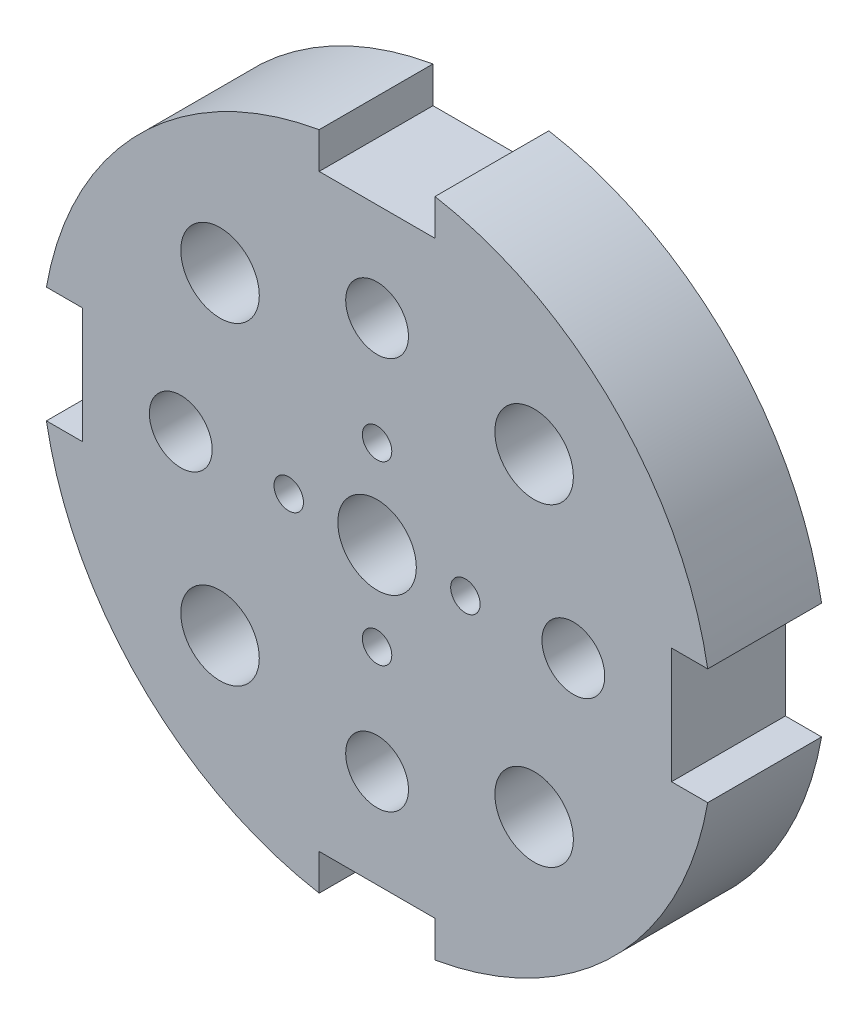
ISO-10303-21;
HEADER;
FILE_DESCRIPTION(('STEP AP214'),'2;1');
FILE_NAME('part.step','',(''),(''),'','','');
FILE_SCHEMA(('AUTOMOTIVE_DESIGN { 1 0 10303 214 1 1 1 1 }'));
ENDSEC;
DATA;
#1=APPLICATION_CONTEXT('core data for automotive mechanical design processes');
#2=APPLICATION_PROTOCOL_DEFINITION('international standard','automotive_design',2000,#1);
#3=PRODUCT_CONTEXT('',#1,'mechanical');
#4=PRODUCT('Part','Part','',(#3));
#5=PRODUCT_RELATED_PRODUCT_CATEGORY('part','',(#4));
#6=PRODUCT_DEFINITION_FORMATION('','',#4);
#7=PRODUCT_DEFINITION_CONTEXT('part definition',#1,'design');
#8=PRODUCT_DEFINITION('design','',#6,#7);
#9=PRODUCT_DEFINITION_SHAPE('','',#8);
#10=(LENGTH_UNIT() NAMED_UNIT(*) SI_UNIT(.MILLI.,.METRE.));
#11=(NAMED_UNIT(*) PLANE_ANGLE_UNIT() SI_UNIT($,.RADIAN.));
#12=(NAMED_UNIT(*) SI_UNIT($,.STERADIAN.) SOLID_ANGLE_UNIT());
#13=UNCERTAINTY_MEASURE_WITH_UNIT(LENGTH_MEASURE(1.E-05),#10,'distance_accuracy_value','');
#14=(GEOMETRIC_REPRESENTATION_CONTEXT(3) GLOBAL_UNCERTAINTY_ASSIGNED_CONTEXT((#13)) GLOBAL_UNIT_ASSIGNED_CONTEXT((#10,
#11,#12)) REPRESENTATION_CONTEXT('',''));
#15=CARTESIAN_POINT('',(0.,0.,0.));
#16=DIRECTION('',(0.,0.,1.));
#17=DIRECTION('',(1.,0.,0.));
#18=AXIS2_PLACEMENT_3D('',#15,#16,#17);
#19=CARTESIAN_POINT('',(0.,0.,-2.9));
#20=DIRECTION('',(0.,0.,-1.));
#21=DIRECTION('',(-1.,0.,0.));
#22=AXIS2_PLACEMENT_3D('',#19,#20,#21);
#23=PLANE('',#22);
#24=CARTESIAN_POINT('',(0.,0.,-2.9));
#25=DIRECTION('',(0.,0.,1.));
#26=DIRECTION('',(1.,0.,0.));
#27=AXIS2_PLACEMENT_3D('',#24,#25,#26);
#28=CIRCLE('',#27,17.1);
#29=CARTESIAN_POINT('',(2.95,-16.8436189698058,-2.9));
#30=VERTEX_POINT('',#29);
#31=CARTESIAN_POINT('',(16.8436189698057,-2.95,-2.9));
#32=VERTEX_POINT('',#31);
#33=EDGE_CURVE('E270',#30,#32,#28,.T.);
#34=ORIENTED_EDGE('',*,*,#33,.F.);
#35=DIRECTION('',(0.,-1.,0.));
#36=VECTOR('',#35,1.);
#37=CARTESIAN_POINT('',(2.95,-15.,-2.9));
#38=LINE('',#37,#36);
#39=CARTESIAN_POINT('',(2.95,-15.,-2.9));
#40=VERTEX_POINT('',#39);
#41=EDGE_CURVE('E168',#40,#30,#38,.T.);
#42=ORIENTED_EDGE('',*,*,#41,.F.);
#43=DIRECTION('',(1.,0.,0.));
#44=VECTOR('',#43,1.);
#45=CARTESIAN_POINT('',(-2.95,-15.,-2.9));
#46=LINE('',#45,#44);
#47=CARTESIAN_POINT('',(-2.95,-15.,-2.9));
#48=VERTEX_POINT('',#47);
#49=EDGE_CURVE('E158',#48,#40,#46,.T.);
#50=ORIENTED_EDGE('',*,*,#49,.F.);
#51=DIRECTION('',(0.,1.,0.));
#52=VECTOR('',#51,1.);
#53=CARTESIAN_POINT('',(-2.95,-22.,-2.9));
#54=LINE('',#53,#52);
#55=CARTESIAN_POINT('',(-2.95,-16.8436189698058,-2.9));
#56=VERTEX_POINT('',#55);
#57=EDGE_CURVE('E142',#56,#48,#54,.T.);
#58=ORIENTED_EDGE('',*,*,#57,.F.);
#59=CARTESIAN_POINT('',(0.,0.,-2.9));
#60=DIRECTION('',(0.,0.,1.));
#61=DIRECTION('',(1.,0.,0.));
#62=AXIS2_PLACEMENT_3D('',#59,#60,#61);
#63=CIRCLE('',#62,17.1);
#64=CARTESIAN_POINT('',(-16.8436189698058,-2.95,-2.9));
#65=VERTEX_POINT('',#64);
#66=EDGE_CURVE('E135',#65,#56,#63,.T.);
#67=ORIENTED_EDGE('',*,*,#66,.F.);
#68=DIRECTION('',(1.,0.,0.));
#69=VECTOR('',#68,1.);
#70=CARTESIAN_POINT('',(-15.,-2.95,-2.9));
#71=LINE('',#70,#69);
#72=CARTESIAN_POINT('',(-15.,-2.95,-2.9));
#73=VERTEX_POINT('',#72);
#74=EDGE_CURVE('E125',#73,#65,#71,.F.);
#75=ORIENTED_EDGE('',*,*,#74,.F.);
#76=DIRECTION('',(0.,1.,0.));
#77=VECTOR('',#76,1.);
#78=CARTESIAN_POINT('',(-15.,2.95,-2.9));
#79=LINE('',#78,#77);
#80=CARTESIAN_POINT('',(-15.,2.95,-2.9));
#81=VERTEX_POINT('',#80);
#82=EDGE_CURVE('E151',#81,#73,#79,.F.);
#83=ORIENTED_EDGE('',*,*,#82,.F.);
#84=DIRECTION('',(1.,0.,0.));
#85=VECTOR('',#84,1.);
#86=CARTESIAN_POINT('',(-22.,2.95,-2.9));
#87=LINE('',#86,#85);
#88=CARTESIAN_POINT('',(-16.8436189698057,2.95,-2.9));
#89=VERTEX_POINT('',#88);
#90=EDGE_CURVE('E205',#89,#81,#87,.T.);
#91=ORIENTED_EDGE('',*,*,#90,.F.);
#92=CARTESIAN_POINT('',(0.,0.,-2.9));
#93=DIRECTION('',(0.,0.,1.));
#94=DIRECTION('',(1.,0.,0.));
#95=AXIS2_PLACEMENT_3D('',#92,#93,#94);
#96=CIRCLE('',#95,17.1);
#97=CARTESIAN_POINT('',(-2.95,16.8436189698058,-2.9));
#98=VERTEX_POINT('',#97);
#99=EDGE_CURVE('E274',#98,#89,#96,.T.);
#100=ORIENTED_EDGE('',*,*,#99,.F.);
#101=DIRECTION('',(0.,1.,0.));
#102=VECTOR('',#101,1.);
#103=CARTESIAN_POINT('',(-2.95,15.,-2.9));
#104=LINE('',#103,#102);
#105=CARTESIAN_POINT('',(-2.95,15.,-2.9));
#106=VERTEX_POINT('',#105);
#107=EDGE_CURVE('E200',#106,#98,#104,.T.);
#108=ORIENTED_EDGE('',*,*,#107,.F.);
#109=DIRECTION('',(-1.,0.,0.));
#110=VECTOR('',#109,1.);
#111=CARTESIAN_POINT('',(2.95,15.,-2.9));
#112=LINE('',#111,#110);
#113=CARTESIAN_POINT('',(2.95,15.,-2.9));
#114=VERTEX_POINT('',#113);
#115=EDGE_CURVE('E195',#114,#106,#112,.T.);
#116=ORIENTED_EDGE('',*,*,#115,.F.);
#117=DIRECTION('',(0.,-1.,0.));
#118=VECTOR('',#117,1.);
#119=CARTESIAN_POINT('',(2.95,22.,-2.9));
#120=LINE('',#119,#118);
#121=CARTESIAN_POINT('',(2.95,16.8436189698057,-2.9));
#122=VERTEX_POINT('',#121);
#123=EDGE_CURVE('E189',#122,#114,#120,.T.);
#124=ORIENTED_EDGE('',*,*,#123,.F.);
#125=CARTESIAN_POINT('',(0.,0.,-2.9));
#126=DIRECTION('',(0.,0.,1.));
#127=DIRECTION('',(1.,0.,0.));
#128=AXIS2_PLACEMENT_3D('',#125,#126,#127);
#129=CIRCLE('',#128,17.1);
#130=CARTESIAN_POINT('',(16.8436189698058,2.95,-2.9));
#131=VERTEX_POINT('',#130);
#132=EDGE_CURVE('E272',#131,#122,#129,.T.);
#133=ORIENTED_EDGE('',*,*,#132,.F.);
#134=DIRECTION('',(1.,0.,0.));
#135=VECTOR('',#134,1.);
#136=CARTESIAN_POINT('',(15.,2.95,-2.9));
#137=LINE('',#136,#135);
#138=CARTESIAN_POINT('',(15.,2.95,-2.9));
#139=VERTEX_POINT('',#138);
#140=EDGE_CURVE('E184',#139,#131,#137,.T.);
#141=ORIENTED_EDGE('',*,*,#140,.F.);
#142=DIRECTION('',(0.,1.,0.));
#143=VECTOR('',#142,1.);
#144=CARTESIAN_POINT('',(15.,-2.95,-2.9));
#145=LINE('',#144,#143);
#146=CARTESIAN_POINT('',(15.,-2.95,-2.9));
#147=VERTEX_POINT('',#146);
#148=EDGE_CURVE('E179',#147,#139,#145,.T.);
#149=ORIENTED_EDGE('',*,*,#148,.F.);
#150=DIRECTION('',(-1.,0.,0.));
#151=VECTOR('',#150,1.);
#152=CARTESIAN_POINT('',(22.,-2.95,-2.9));
#153=LINE('',#152,#151);
#154=EDGE_CURVE('E173',#32,#147,#153,.T.);
#155=ORIENTED_EDGE('',*,*,#154,.F.);
#156=EDGE_LOOP('',(#34,#42,#50,#58,#67,#75,#83,#91,#100,#108,#116,#124,#133,#141,#149,#155));
#157=FACE_BOUND('',#156,.T.);
#158=CARTESIAN_POINT('',(0.,-10.,-2.9));
#159=DIRECTION('',(0.,0.,-1.));
#160=DIRECTION('',(-1.,0.,0.));
#161=AXIS2_PLACEMENT_3D('',#158,#159,#160);
#162=CIRCLE('',#161,1.6);
#163=CARTESIAN_POINT('',(-1.6,-10.,-2.9));
#164=VERTEX_POINT('',#163);
#165=EDGE_CURVE('E146',#164,#164,#162,.F.);
#166=ORIENTED_EDGE('',*,*,#165,.T.);
#167=EDGE_LOOP('',(#166));
#168=FACE_BOUND('',#167,.T.);
#169=CARTESIAN_POINT('',(0.,10.,-2.9));
#170=DIRECTION('',(0.,0.,-1.));
#171=DIRECTION('',(-1.,0.,0.));
#172=AXIS2_PLACEMENT_3D('',#169,#170,#171);
#173=CIRCLE('',#172,1.6);
#174=CARTESIAN_POINT('',(-1.6,10.,-2.9));
#175=VERTEX_POINT('',#174);
#176=EDGE_CURVE('E278',#175,#175,#173,.F.);
#177=ORIENTED_EDGE('',*,*,#176,.T.);
#178=EDGE_LOOP('',(#177));
#179=FACE_BOUND('',#178,.T.);
#180=CARTESIAN_POINT('',(4.5,0.,-2.9));
#181=DIRECTION('',(0.,0.,1.));
#182=DIRECTION('',(1.,0.,0.));
#183=AXIS2_PLACEMENT_3D('',#180,#181,#182);
#184=CIRCLE('',#183,0.75);
#185=CARTESIAN_POINT('',(5.25,0.,-2.9));
#186=VERTEX_POINT('',#185);
#187=EDGE_CURVE('E281',#186,#186,#184,.T.);
#188=ORIENTED_EDGE('',*,*,#187,.T.);
#189=EDGE_LOOP('',(#188));
#190=FACE_BOUND('',#189,.T.);
#191=CARTESIAN_POINT('',(0.,4.5,-2.9));
#192=DIRECTION('',(0.,0.,1.));
#193=DIRECTION('',(1.,0.,0.));
#194=AXIS2_PLACEMENT_3D('',#191,#192,#193);
#195=CIRCLE('',#194,0.75);
#196=CARTESIAN_POINT('',(0.75,4.5,-2.9));
#197=VERTEX_POINT('',#196);
#198=EDGE_CURVE('E284',#197,#197,#195,.T.);
#199=ORIENTED_EDGE('',*,*,#198,.T.);
#200=EDGE_LOOP('',(#199));
#201=FACE_BOUND('',#200,.T.);
#202=CARTESIAN_POINT('',(-4.5,0.,-2.9));
#203=DIRECTION('',(0.,0.,1.));
#204=DIRECTION('',(1.,0.,0.));
#205=AXIS2_PLACEMENT_3D('',#202,#203,#204);
#206=CIRCLE('',#205,0.75);
#207=CARTESIAN_POINT('',(-3.75,0.,-2.9));
#208=VERTEX_POINT('',#207);
#209=EDGE_CURVE('E287',#208,#208,#206,.T.);
#210=ORIENTED_EDGE('',*,*,#209,.T.);
#211=EDGE_LOOP('',(#210));
#212=FACE_BOUND('',#211,.T.);
#213=CARTESIAN_POINT('',(0.,-4.5,-2.9));
#214=DIRECTION('',(0.,0.,1.));
#215=DIRECTION('',(1.,0.,0.));
#216=AXIS2_PLACEMENT_3D('',#213,#214,#215);
#217=CIRCLE('',#216,0.75);
#218=CARTESIAN_POINT('',(0.75,-4.5,-2.9));
#219=VERTEX_POINT('',#218);
#220=EDGE_CURVE('E290',#219,#219,#217,.T.);
#221=ORIENTED_EDGE('',*,*,#220,.T.);
#222=EDGE_LOOP('',(#221));
#223=FACE_BOUND('',#222,.T.);
#224=CARTESIAN_POINT('',(0.,0.,-2.9));
#225=DIRECTION('',(0.,0.,1.));
#226=DIRECTION('',(1.,0.,0.));
#227=AXIS2_PLACEMENT_3D('',#224,#225,#226);
#228=CIRCLE('',#227,2.);
#229=CARTESIAN_POINT('',(2.,0.,-2.9));
#230=VERTEX_POINT('',#229);
#231=EDGE_CURVE('E293',#230,#230,#228,.T.);
#232=ORIENTED_EDGE('',*,*,#231,.T.);
#233=EDGE_LOOP('',(#232));
#234=FACE_BOUND('',#233,.T.);
#235=CARTESIAN_POINT('',(-10.,0.,-2.9));
#236=DIRECTION('',(0.,0.,-1.));
#237=DIRECTION('',(-1.,0.,0.));
#238=AXIS2_PLACEMENT_3D('',#235,#236,#237);
#239=CIRCLE('',#238,1.6);
#240=CARTESIAN_POINT('',(-11.6,0.,-2.9));
#241=VERTEX_POINT('',#240);
#242=EDGE_CURVE('E296',#241,#241,#239,.F.);
#243=ORIENTED_EDGE('',*,*,#242,.T.);
#244=EDGE_LOOP('',(#243));
#245=FACE_BOUND('',#244,.T.);
#246=CARTESIAN_POINT('',(10.,0.,-2.9));
#247=DIRECTION('',(0.,0.,-1.));
#248=DIRECTION('',(-1.,0.,0.));
#249=AXIS2_PLACEMENT_3D('',#246,#247,#248);
#250=CIRCLE('',#249,1.6);
#251=CARTESIAN_POINT('',(8.4,0.,-2.9));
#252=VERTEX_POINT('',#251);
#253=EDGE_CURVE('E299',#252,#252,#250,.F.);
#254=ORIENTED_EDGE('',*,*,#253,.T.);
#255=EDGE_LOOP('',(#254));
#256=FACE_BOUND('',#255,.T.);
#257=CARTESIAN_POINT('',(8.,-8.,-2.9));
#258=DIRECTION('',(0.,0.,1.));
#259=DIRECTION('',(1.,0.,0.));
#260=AXIS2_PLACEMENT_3D('',#257,#258,#259);
#261=CIRCLE('',#260,2.);
#262=CARTESIAN_POINT('',(10.,-8.,-2.9));
#263=VERTEX_POINT('',#262);
#264=EDGE_CURVE('E302',#263,#263,#261,.T.);
#265=ORIENTED_EDGE('',*,*,#264,.T.);
#266=EDGE_LOOP('',(#265));
#267=FACE_BOUND('',#266,.T.);
#268=CARTESIAN_POINT('',(8.,8.,-2.9));
#269=DIRECTION('',(0.,0.,1.));
#270=DIRECTION('',(1.,0.,0.));
#271=AXIS2_PLACEMENT_3D('',#268,#269,#270);
#272=CIRCLE('',#271,2.);
#273=CARTESIAN_POINT('',(10.,8.,-2.9));
#274=VERTEX_POINT('',#273);
#275=EDGE_CURVE('E305',#274,#274,#272,.T.);
#276=ORIENTED_EDGE('',*,*,#275,.T.);
#277=EDGE_LOOP('',(#276));
#278=FACE_BOUND('',#277,.T.);
#279=CARTESIAN_POINT('',(-8.,8.,-2.9));
#280=DIRECTION('',(0.,0.,1.));
#281=DIRECTION('',(1.,0.,0.));
#282=AXIS2_PLACEMENT_3D('',#279,#280,#281);
#283=CIRCLE('',#282,2.);
#284=CARTESIAN_POINT('',(-6.,8.,-2.9));
#285=VERTEX_POINT('',#284);
#286=EDGE_CURVE('E307',#285,#285,#283,.T.);
#287=ORIENTED_EDGE('',*,*,#286,.T.);
#288=EDGE_LOOP('',(#287));
#289=FACE_BOUND('',#288,.T.);
#290=CARTESIAN_POINT('',(-8.,-8.,-2.9));
#291=DIRECTION('',(0.,0.,1.));
#292=DIRECTION('',(1.,0.,0.));
#293=AXIS2_PLACEMENT_3D('',#290,#291,#292);
#294=CIRCLE('',#293,2.);
#295=CARTESIAN_POINT('',(-6.,-8.,-2.9));
#296=VERTEX_POINT('',#295);
#297=EDGE_CURVE('E19',#296,#296,#294,.T.);
#298=ORIENTED_EDGE('',*,*,#297,.T.);
#299=EDGE_LOOP('',(#298));
#300=FACE_BOUND('',#299,.T.);
#301=ADVANCED_FACE('F16',(#157,#168,#179,#190,#201,#212,#223,#234,#245,#256,#267,#278,#289,
#300),#23,.T.);
#302=CARTESIAN_POINT('',(-8.,-8.,14.9505446068038));
#303=DIRECTION('',(0.,0.,1.));
#304=DIRECTION('',(1.,0.,0.));
#305=AXIS2_PLACEMENT_3D('',#302,#303,#304);
#306=CYLINDRICAL_SURFACE('',#305,2.);
#307=CARTESIAN_POINT('',(-8.,-8.,2.9));
#308=DIRECTION('',(0.,0.,1.));
#309=DIRECTION('',(1.,0.,0.));
#310=AXIS2_PLACEMENT_3D('',#307,#308,#309);
#311=CIRCLE('',#310,2.);
#312=CARTESIAN_POINT('',(-6.,-8.,2.9));
#313=VERTEX_POINT('',#312);
#314=EDGE_CURVE('E267',#313,#313,#311,.T.);
#315=ORIENTED_EDGE('',*,*,#314,.T.);
#316=EDGE_LOOP('',(#315));
#317=FACE_BOUND('',#316,.T.);
#318=ORIENTED_EDGE('',*,*,#297,.F.);
#319=EDGE_LOOP('',(#318));
#320=FACE_BOUND('',#319,.T.);
#321=ADVANCED_FACE('F315',(#317,#320),#306,.F.);
#322=CARTESIAN_POINT('',(-8.,8.,14.9505446068038));
#323=DIRECTION('',(0.,0.,1.));
#324=DIRECTION('',(1.,0.,0.));
#325=AXIS2_PLACEMENT_3D('',#322,#323,#324);
#326=CYLINDRICAL_SURFACE('',#325,2.);
#327=CARTESIAN_POINT('',(-8.,8.,2.9));
#328=DIRECTION('',(0.,0.,1.));
#329=DIRECTION('',(1.,0.,0.));
#330=AXIS2_PLACEMENT_3D('',#327,#328,#329);
#331=CIRCLE('',#330,2.);
#332=CARTESIAN_POINT('',(-6.,8.,2.9));
#333=VERTEX_POINT('',#332);
#334=EDGE_CURVE('E264',#333,#333,#331,.T.);
#335=ORIENTED_EDGE('',*,*,#334,.T.);
#336=EDGE_LOOP('',(#335));
#337=FACE_BOUND('',#336,.T.);
#338=ORIENTED_EDGE('',*,*,#286,.F.);
#339=EDGE_LOOP('',(#338));
#340=FACE_BOUND('',#339,.T.);
#341=ADVANCED_FACE('F317',(#337,#340),#326,.F.);
#342=CARTESIAN_POINT('',(8.,8.,14.9505446068038));
#343=DIRECTION('',(0.,0.,1.));
#344=DIRECTION('',(1.,0.,0.));
#345=AXIS2_PLACEMENT_3D('',#342,#343,#344);
#346=CYLINDRICAL_SURFACE('',#345,2.);
#347=CARTESIAN_POINT('',(8.,8.,2.9));
#348=DIRECTION('',(0.,0.,1.));
#349=DIRECTION('',(1.,0.,0.));
#350=AXIS2_PLACEMENT_3D('',#347,#348,#349);
#351=CIRCLE('',#350,2.);
#352=CARTESIAN_POINT('',(10.,8.,2.9));
#353=VERTEX_POINT('',#352);
#354=EDGE_CURVE('E261',#353,#353,#351,.T.);
#355=ORIENTED_EDGE('',*,*,#354,.T.);
#356=EDGE_LOOP('',(#355));
#357=FACE_BOUND('',#356,.T.);
#358=ORIENTED_EDGE('',*,*,#275,.F.);
#359=EDGE_LOOP('',(#358));
#360=FACE_BOUND('',#359,.T.);
#361=ADVANCED_FACE('F324',(#357,#360),#346,.F.);
#362=CARTESIAN_POINT('',(8.,-8.,14.9505446068038));
#363=DIRECTION('',(0.,0.,1.));
#364=DIRECTION('',(1.,0.,0.));
#365=AXIS2_PLACEMENT_3D('',#362,#363,#364);
#366=CYLINDRICAL_SURFACE('',#365,2.);
#367=CARTESIAN_POINT('',(8.,-8.,2.9));
#368=DIRECTION('',(0.,0.,1.));
#369=DIRECTION('',(1.,0.,0.));
#370=AXIS2_PLACEMENT_3D('',#367,#368,#369);
#371=CIRCLE('',#370,2.);
#372=CARTESIAN_POINT('',(10.,-8.,2.9));
#373=VERTEX_POINT('',#372);
#374=EDGE_CURVE('E258',#373,#373,#371,.T.);
#375=ORIENTED_EDGE('',*,*,#374,.T.);
#376=EDGE_LOOP('',(#375));
#377=FACE_BOUND('',#376,.T.);
#378=ORIENTED_EDGE('',*,*,#264,.F.);
#379=EDGE_LOOP('',(#378));
#380=FACE_BOUND('',#379,.T.);
#381=ADVANCED_FACE('F430',(#377,#380),#366,.F.);
#382=CARTESIAN_POINT('',(10.,0.,-13.9763450014739));
#383=DIRECTION('',(0.,0.,-1.));
#384=DIRECTION('',(-1.,0.,0.));
#385=AXIS2_PLACEMENT_3D('',#382,#383,#384);
#386=CYLINDRICAL_SURFACE('',#385,1.6);
#387=CARTESIAN_POINT('',(10.,0.,2.9));
#388=DIRECTION('',(0.,0.,-1.));
#389=DIRECTION('',(-1.,0.,0.));
#390=AXIS2_PLACEMENT_3D('',#387,#388,#389);
#391=CIRCLE('',#390,1.6);
#392=CARTESIAN_POINT('',(8.4,0.,2.9));
#393=VERTEX_POINT('',#392);
#394=EDGE_CURVE('E255',#393,#393,#391,.F.);
#395=ORIENTED_EDGE('',*,*,#394,.T.);
#396=EDGE_LOOP('',(#395));
#397=FACE_BOUND('',#396,.T.);
#398=ORIENTED_EDGE('',*,*,#253,.F.);
#399=EDGE_LOOP('',(#398));
#400=FACE_BOUND('',#399,.T.);
#401=ADVANCED_FACE('F426',(#397,#400),#386,.F.);
#402=CARTESIAN_POINT('',(-10.,0.,-13.9763450014739));
#403=DIRECTION('',(0.,0.,-1.));
#404=DIRECTION('',(-1.,0.,0.));
#405=AXIS2_PLACEMENT_3D('',#402,#403,#404);
#406=CYLINDRICAL_SURFACE('',#405,1.6);
#407=CARTESIAN_POINT('',(-10.,0.,2.9));
#408=DIRECTION('',(0.,0.,-1.));
#409=DIRECTION('',(-1.,0.,0.));
#410=AXIS2_PLACEMENT_3D('',#407,#408,#409);
#411=CIRCLE('',#410,1.6);
#412=CARTESIAN_POINT('',(-11.6,0.,2.9));
#413=VERTEX_POINT('',#412);
#414=EDGE_CURVE('E252',#413,#413,#411,.F.);
#415=ORIENTED_EDGE('',*,*,#414,.T.);
#416=EDGE_LOOP('',(#415));
#417=FACE_BOUND('',#416,.T.);
#418=ORIENTED_EDGE('',*,*,#242,.F.);
#419=EDGE_LOOP('',(#418));
#420=FACE_BOUND('',#419,.T.);
#421=ADVANCED_FACE('F422',(#417,#420),#406,.F.);
#422=CARTESIAN_POINT('',(0.,0.,16.3974923792316));
#423=DIRECTION('',(0.,0.,1.));
#424=DIRECTION('',(1.,0.,0.));
#425=AXIS2_PLACEMENT_3D('',#422,#423,#424);
#426=CYLINDRICAL_SURFACE('',#425,2.);
#427=CARTESIAN_POINT('',(0.,0.,2.9));
#428=DIRECTION('',(0.,0.,1.));
#429=DIRECTION('',(1.,0.,0.));
#430=AXIS2_PLACEMENT_3D('',#427,#428,#429);
#431=CIRCLE('',#430,2.);
#432=CARTESIAN_POINT('',(2.,0.,2.9));
#433=VERTEX_POINT('',#432);
#434=EDGE_CURVE('E249',#433,#433,#431,.T.);
#435=ORIENTED_EDGE('',*,*,#434,.T.);
#436=EDGE_LOOP('',(#435));
#437=FACE_BOUND('',#436,.T.);
#438=ORIENTED_EDGE('',*,*,#231,.F.);
#439=EDGE_LOOP('',(#438));
#440=FACE_BOUND('',#439,.T.);
#441=ADVANCED_FACE('F418',(#437,#440),#426,.F.);
#442=CARTESIAN_POINT('',(0.,-4.5,16.3974923792316));
#443=DIRECTION('',(0.,0.,1.));
#444=DIRECTION('',(1.,0.,0.));
#445=AXIS2_PLACEMENT_3D('',#442,#443,#444);
#446=CYLINDRICAL_SURFACE('',#445,0.75);
#447=CARTESIAN_POINT('',(0.,-4.5,2.9));
#448=DIRECTION('',(0.,0.,1.));
#449=DIRECTION('',(1.,0.,0.));
#450=AXIS2_PLACEMENT_3D('',#447,#448,#449);
#451=CIRCLE('',#450,0.75);
#452=CARTESIAN_POINT('',(0.75,-4.5,2.9));
#453=VERTEX_POINT('',#452);
#454=EDGE_CURVE('E246',#453,#453,#451,.T.);
#455=ORIENTED_EDGE('',*,*,#454,.T.);
#456=EDGE_LOOP('',(#455));
#457=FACE_BOUND('',#456,.T.);
#458=ORIENTED_EDGE('',*,*,#220,.F.);
#459=EDGE_LOOP('',(#458));
#460=FACE_BOUND('',#459,.T.);
#461=ADVANCED_FACE('F414',(#457,#460),#446,.F.);
#462=CARTESIAN_POINT('',(-4.5,0.,16.3974923792316));
#463=DIRECTION('',(0.,0.,1.));
#464=DIRECTION('',(1.,0.,0.));
#465=AXIS2_PLACEMENT_3D('',#462,#463,#464);
#466=CYLINDRICAL_SURFACE('',#465,0.75);
#467=CARTESIAN_POINT('',(-4.5,0.,2.9));
#468=DIRECTION('',(0.,0.,1.));
#469=DIRECTION('',(1.,0.,0.));
#470=AXIS2_PLACEMENT_3D('',#467,#468,#469);
#471=CIRCLE('',#470,0.75);
#472=CARTESIAN_POINT('',(-3.75,0.,2.9));
#473=VERTEX_POINT('',#472);
#474=EDGE_CURVE('E243',#473,#473,#471,.T.);
#475=ORIENTED_EDGE('',*,*,#474,.T.);
#476=EDGE_LOOP('',(#475));
#477=FACE_BOUND('',#476,.T.);
#478=ORIENTED_EDGE('',*,*,#209,.F.);
#479=EDGE_LOOP('',(#478));
#480=FACE_BOUND('',#479,.T.);
#481=ADVANCED_FACE('F410',(#477,#480),#466,.F.);
#482=CARTESIAN_POINT('',(0.,4.5,16.3974923792316));
#483=DIRECTION('',(0.,0.,1.));
#484=DIRECTION('',(1.,0.,0.));
#485=AXIS2_PLACEMENT_3D('',#482,#483,#484);
#486=CYLINDRICAL_SURFACE('',#485,0.75);
#487=CARTESIAN_POINT('',(0.,4.5,2.9));
#488=DIRECTION('',(0.,0.,1.));
#489=DIRECTION('',(1.,0.,0.));
#490=AXIS2_PLACEMENT_3D('',#487,#488,#489);
#491=CIRCLE('',#490,0.75);
#492=CARTESIAN_POINT('',(0.75,4.5,2.9));
#493=VERTEX_POINT('',#492);
#494=EDGE_CURVE('E240',#493,#493,#491,.T.);
#495=ORIENTED_EDGE('',*,*,#494,.T.);
#496=EDGE_LOOP('',(#495));
#497=FACE_BOUND('',#496,.T.);
#498=ORIENTED_EDGE('',*,*,#198,.F.);
#499=EDGE_LOOP('',(#498));
#500=FACE_BOUND('',#499,.T.);
#501=ADVANCED_FACE('F406',(#497,#500),#486,.F.);
#502=CARTESIAN_POINT('',(4.5,0.,16.3974923792316));
#503=DIRECTION('',(0.,0.,1.));
#504=DIRECTION('',(1.,0.,0.));
#505=AXIS2_PLACEMENT_3D('',#502,#503,#504);
#506=CYLINDRICAL_SURFACE('',#505,0.75);
#507=CARTESIAN_POINT('',(4.5,0.,2.9));
#508=DIRECTION('',(0.,0.,1.));
#509=DIRECTION('',(1.,0.,0.));
#510=AXIS2_PLACEMENT_3D('',#507,#508,#509);
#511=CIRCLE('',#510,0.75);
#512=CARTESIAN_POINT('',(5.25,0.,2.9));
#513=VERTEX_POINT('',#512);
#514=EDGE_CURVE('E237',#513,#513,#511,.T.);
#515=ORIENTED_EDGE('',*,*,#514,.T.);
#516=EDGE_LOOP('',(#515));
#517=FACE_BOUND('',#516,.T.);
#518=ORIENTED_EDGE('',*,*,#187,.F.);
#519=EDGE_LOOP('',(#518));
#520=FACE_BOUND('',#519,.T.);
#521=ADVANCED_FACE('F402',(#517,#520),#506,.F.);
#522=CARTESIAN_POINT('',(0.,10.,-13.9763450014739));
#523=DIRECTION('',(0.,0.,-1.));
#524=DIRECTION('',(-1.,0.,0.));
#525=AXIS2_PLACEMENT_3D('',#522,#523,#524);
#526=CYLINDRICAL_SURFACE('',#525,1.6);
#527=CARTESIAN_POINT('',(0.,10.,2.9));
#528=DIRECTION('',(0.,0.,-1.));
#529=DIRECTION('',(-1.,0.,0.));
#530=AXIS2_PLACEMENT_3D('',#527,#528,#529);
#531=CIRCLE('',#530,1.6);
#532=CARTESIAN_POINT('',(-1.6,10.,2.9));
#533=VERTEX_POINT('',#532);
#534=EDGE_CURVE('E234',#533,#533,#531,.F.);
#535=ORIENTED_EDGE('',*,*,#534,.T.);
#536=EDGE_LOOP('',(#535));
#537=FACE_BOUND('',#536,.T.);
#538=ORIENTED_EDGE('',*,*,#176,.F.);
#539=EDGE_LOOP('',(#538));
#540=FACE_BOUND('',#539,.T.);
#541=ADVANCED_FACE('F398',(#537,#540),#526,.F.);
#542=CARTESIAN_POINT('',(0.,-10.,-13.9763450014739));
#543=DIRECTION('',(0.,0.,-1.));
#544=DIRECTION('',(-1.,0.,0.));
#545=AXIS2_PLACEMENT_3D('',#542,#543,#544);
#546=CYLINDRICAL_SURFACE('',#545,1.6);
#547=CARTESIAN_POINT('',(0.,-10.,2.9));
#548=DIRECTION('',(0.,0.,-1.));
#549=DIRECTION('',(-1.,0.,0.));
#550=AXIS2_PLACEMENT_3D('',#547,#548,#549);
#551=CIRCLE('',#550,1.6);
#552=CARTESIAN_POINT('',(-1.6,-10.,2.9));
#553=VERTEX_POINT('',#552);
#554=EDGE_CURVE('E231',#553,#553,#551,.F.);
#555=ORIENTED_EDGE('',*,*,#554,.T.);
#556=EDGE_LOOP('',(#555));
#557=FACE_BOUND('',#556,.T.);
#558=ORIENTED_EDGE('',*,*,#165,.F.);
#559=EDGE_LOOP('',(#558));
#560=FACE_BOUND('',#559,.T.);
#561=ADVANCED_FACE('F395',(#557,#560),#546,.F.);
#562=CARTESIAN_POINT('',(0.,0.,2.9));
#563=DIRECTION('',(0.,0.,1.));
#564=DIRECTION('',(1.,0.,0.));
#565=AXIS2_PLACEMENT_3D('',#562,#563,#564);
#566=CYLINDRICAL_SURFACE('',#565,17.1);
#567=CARTESIAN_POINT('',(0.,0.,2.9));
#568=DIRECTION('',(0.,0.,1.));
#569=DIRECTION('',(1.,0.,0.));
#570=AXIS2_PLACEMENT_3D('',#567,#568,#569);
#571=CIRCLE('',#570,17.1);
#572=CARTESIAN_POINT('',(-2.95,-16.8436189698058,2.9));
#573=VERTEX_POINT('',#572);
#574=CARTESIAN_POINT('',(-16.8436189698058,-2.95,2.9));
#575=VERTEX_POINT('',#574);
#576=EDGE_CURVE('E150',#573,#575,#571,.F.);
#577=ORIENTED_EDGE('',*,*,#576,.T.);
#578=DIRECTION('',(0.,0.,1.));
#579=VECTOR('',#578,1.);
#580=CARTESIAN_POINT('',(-16.8436189698058,-2.95,-9.92530105386466));
#581=LINE('',#580,#579);
#582=EDGE_CURVE('E130',#65,#575,#581,.T.);
#583=ORIENTED_EDGE('',*,*,#582,.F.);
#584=ORIENTED_EDGE('',*,*,#66,.T.);
#585=DIRECTION('',(0.,0.,1.));
#586=VECTOR('',#585,1.);
#587=CARTESIAN_POINT('',(-2.95,-16.8436189698058,-9.92530105386466));
#588=LINE('',#587,#586);
#589=EDGE_CURVE('E165',#573,#56,#588,.F.);
#590=ORIENTED_EDGE('',*,*,#589,.F.);
#591=EDGE_LOOP('',(#577,#583,#584,#590));
#592=FACE_BOUND('',#591,.T.);
#593=ADVANCED_FACE('F149',(#592),#566,.T.);
#594=CARTESIAN_POINT('',(-15.,-2.95,-9.92530105386466));
#595=DIRECTION('',(0.,1.,0.));
#596=DIRECTION('',(0.,0.,1.));
#597=AXIS2_PLACEMENT_3D('',#594,#595,#596);
#598=PLANE('',#597);
#599=ORIENTED_EDGE('',*,*,#74,.T.);
#600=ORIENTED_EDGE('',*,*,#582,.T.);
#601=DIRECTION('',(-1.,0.,0.));
#602=VECTOR('',#601,1.);
#603=CARTESIAN_POINT('',(0.,-2.95,2.9));
#604=LINE('',#603,#602);
#605=CARTESIAN_POINT('',(-15.,-2.95,2.9));
#606=VERTEX_POINT('',#605);
#607=EDGE_CURVE('E230',#575,#606,#604,.F.);
#608=ORIENTED_EDGE('',*,*,#607,.T.);
#609=DIRECTION('',(0.,0.,1.));
#610=VECTOR('',#609,1.);
#611=CARTESIAN_POINT('',(-15.,-2.95,-9.92530105386466));
#612=LINE('',#611,#610);
#613=EDGE_CURVE('E132',#73,#606,#612,.T.);
#614=ORIENTED_EDGE('',*,*,#613,.F.);
#615=EDGE_LOOP('',(#599,#600,#608,#614));
#616=FACE_BOUND('',#615,.T.);
#617=ADVANCED_FACE('F127',(#616),#598,.T.);
#618=CARTESIAN_POINT('',(-15.,2.95,-9.92530105386466));
#619=DIRECTION('',(-1.,0.,0.));
#620=DIRECTION('',(0.,0.,1.));
#621=AXIS2_PLACEMENT_3D('',#618,#619,#620);
#622=PLANE('',#621);
#623=ORIENTED_EDGE('',*,*,#82,.T.);
#624=ORIENTED_EDGE('',*,*,#613,.T.);
#625=DIRECTION('',(0.,1.,0.));
#626=VECTOR('',#625,1.);
#627=CARTESIAN_POINT('',(-15.,0.,2.9));
#628=LINE('',#627,#626);
#629=CARTESIAN_POINT('',(-15.,2.95,2.9));
#630=VERTEX_POINT('',#629);
#631=EDGE_CURVE('E702',#606,#630,#628,.T.);
#632=ORIENTED_EDGE('',*,*,#631,.T.);
#633=DIRECTION('',(0.,0.,1.));
#634=VECTOR('',#633,1.);
#635=CARTESIAN_POINT('',(-15.,2.95,-9.92530105386466));
#636=LINE('',#635,#634);
#637=EDGE_CURVE('E207',#81,#630,#636,.T.);
#638=ORIENTED_EDGE('',*,*,#637,.F.);
#639=EDGE_LOOP('',(#623,#624,#632,#638));
#640=FACE_BOUND('',#639,.T.);
#641=ADVANCED_FACE('F386',(#640),#622,.T.);
#642=CARTESIAN_POINT('',(-22.,2.95,-9.92530105386466));
#643=DIRECTION('',(0.,-1.,0.));
#644=DIRECTION('',(1.,0.,0.));
#645=AXIS2_PLACEMENT_3D('',#642,#643,#644);
#646=PLANE('',#645);
#647=ORIENTED_EDGE('',*,*,#90,.T.);
#648=ORIENTED_EDGE('',*,*,#637,.T.);
#649=DIRECTION('',(-1.,0.,0.));
#650=VECTOR('',#649,1.);
#651=CARTESIAN_POINT('',(0.,2.95,2.9));
#652=LINE('',#651,#650);
#653=CARTESIAN_POINT('',(-16.8436189698057,2.95,2.9));
#654=VERTEX_POINT('',#653);
#655=EDGE_CURVE('E228',#630,#654,#652,.T.);
#656=ORIENTED_EDGE('',*,*,#655,.T.);
#657=DIRECTION('',(0.,0.,1.));
#658=VECTOR('',#657,1.);
#659=CARTESIAN_POINT('',(-16.8436189698057,2.95,2.9));
#660=LINE('',#659,#658);
#661=EDGE_CURVE('E202',#89,#654,#660,.T.);
#662=ORIENTED_EDGE('',*,*,#661,.F.);
#663=EDGE_LOOP('',(#647,#648,#656,#662));
#664=FACE_BOUND('',#663,.T.);
#665=ADVANCED_FACE('F382',(#664),#646,.T.);
#666=CARTESIAN_POINT('',(0.,0.,2.9));
#667=DIRECTION('',(0.,0.,1.));
#668=DIRECTION('',(1.,0.,0.));
#669=AXIS2_PLACEMENT_3D('',#666,#667,#668);
#670=CYLINDRICAL_SURFACE('',#669,17.1);
#671=ORIENTED_EDGE('',*,*,#99,.T.);
#672=ORIENTED_EDGE('',*,*,#661,.T.);
#673=CARTESIAN_POINT('',(0.,0.,2.9));
#674=DIRECTION('',(0.,0.,1.));
#675=DIRECTION('',(1.,0.,0.));
#676=AXIS2_PLACEMENT_3D('',#673,#674,#675);
#677=CIRCLE('',#676,17.1);
#678=CARTESIAN_POINT('',(-2.95,16.8436189698058,2.9));
#679=VERTEX_POINT('',#678);
#680=EDGE_CURVE('E224',#654,#679,#677,.F.);
#681=ORIENTED_EDGE('',*,*,#680,.T.);
#682=DIRECTION('',(0.,0.,1.));
#683=VECTOR('',#682,1.);
#684=CARTESIAN_POINT('',(-2.95,16.8436189698058,-9.92530105386466));
#685=LINE('',#684,#683);
#686=EDGE_CURVE('E197',#98,#679,#685,.T.);
#687=ORIENTED_EDGE('',*,*,#686,.F.);
#688=EDGE_LOOP('',(#671,#672,#681,#687));
#689=FACE_BOUND('',#688,.T.);
#690=ADVANCED_FACE('F378',(#689),#670,.T.);
#691=CARTESIAN_POINT('',(-2.95,15.,-9.92530105386466));
#692=DIRECTION('',(1.,0.,0.));
#693=DIRECTION('',(0.,1.,0.));
#694=AXIS2_PLACEMENT_3D('',#691,#692,#693);
#695=PLANE('',#694);
#696=ORIENTED_EDGE('',*,*,#107,.T.);
#697=ORIENTED_EDGE('',*,*,#686,.T.);
#698=DIRECTION('',(0.,1.,0.));
#699=VECTOR('',#698,1.);
#700=CARTESIAN_POINT('',(-2.95,0.,2.9));
#701=LINE('',#700,#699);
#702=CARTESIAN_POINT('',(-2.95,15.,2.9));
#703=VERTEX_POINT('',#702);
#704=EDGE_CURVE('E227',#679,#703,#701,.F.);
#705=ORIENTED_EDGE('',*,*,#704,.T.);
#706=DIRECTION('',(0.,0.,1.));
#707=VECTOR('',#706,1.);
#708=CARTESIAN_POINT('',(-2.95,15.,-9.92530105386466));
#709=LINE('',#708,#707);
#710=EDGE_CURVE('E192',#106,#703,#709,.T.);
#711=ORIENTED_EDGE('',*,*,#710,.F.);
#712=EDGE_LOOP('',(#696,#697,#705,#711));
#713=FACE_BOUND('',#712,.T.);
#714=ADVANCED_FACE('F374',(#713),#695,.T.);
#715=CARTESIAN_POINT('',(2.95,15.,-9.92530105386466));
#716=DIRECTION('',(0.,1.,0.));
#717=DIRECTION('',(-1.,0.,0.));
#718=AXIS2_PLACEMENT_3D('',#715,#716,#717);
#719=PLANE('',#718);
#720=ORIENTED_EDGE('',*,*,#115,.T.);
#721=ORIENTED_EDGE('',*,*,#710,.T.);
#722=DIRECTION('',(-1.,0.,0.));
#723=VECTOR('',#722,1.);
#724=CARTESIAN_POINT('',(0.,15.,2.9));
#725=LINE('',#724,#723);
#726=CARTESIAN_POINT('',(2.95,15.,2.9));
#727=VERTEX_POINT('',#726);
#728=EDGE_CURVE('E741',#703,#727,#725,.F.);
#729=ORIENTED_EDGE('',*,*,#728,.T.);
#730=DIRECTION('',(0.,0.,1.));
#731=VECTOR('',#730,1.);
#732=CARTESIAN_POINT('',(2.95,15.,-9.92530105386466));
#733=LINE('',#732,#731);
#734=EDGE_CURVE('E191',#114,#727,#733,.T.);
#735=ORIENTED_EDGE('',*,*,#734,.F.);
#736=EDGE_LOOP('',(#720,#721,#729,#735));
#737=FACE_BOUND('',#736,.T.);
#738=ADVANCED_FACE('F370',(#737),#719,.T.);
#739=CARTESIAN_POINT('',(2.95,22.,-9.92530105386466));
#740=DIRECTION('',(-1.,0.,0.));
#741=DIRECTION('',(0.,-1.,0.));
#742=AXIS2_PLACEMENT_3D('',#739,#740,#741);
#743=PLANE('',#742);
#744=ORIENTED_EDGE('',*,*,#123,.T.);
#745=ORIENTED_EDGE('',*,*,#734,.T.);
#746=DIRECTION('',(0.,1.,0.));
#747=VECTOR('',#746,1.);
#748=CARTESIAN_POINT('',(2.95,0.,2.9));
#749=LINE('',#748,#747);
#750=CARTESIAN_POINT('',(2.95,16.8436189698057,2.9));
#751=VERTEX_POINT('',#750);
#752=EDGE_CURVE('E223',#727,#751,#749,.T.);
#753=ORIENTED_EDGE('',*,*,#752,.T.);
#754=DIRECTION('',(0.,0.,1.));
#755=VECTOR('',#754,1.);
#756=CARTESIAN_POINT('',(2.94999999999999,16.8436189698057,2.9));
#757=LINE('',#756,#755);
#758=EDGE_CURVE('E186',#122,#751,#757,.T.);
#759=ORIENTED_EDGE('',*,*,#758,.F.);
#760=EDGE_LOOP('',(#744,#745,#753,#759));
#761=FACE_BOUND('',#760,.T.);
#762=ADVANCED_FACE('F366',(#761),#743,.T.);
#763=CARTESIAN_POINT('',(0.,0.,2.9));
#764=DIRECTION('',(0.,0.,1.));
#765=DIRECTION('',(1.,0.,0.));
#766=AXIS2_PLACEMENT_3D('',#763,#764,#765);
#767=CYLINDRICAL_SURFACE('',#766,17.1);
#768=ORIENTED_EDGE('',*,*,#132,.T.);
#769=ORIENTED_EDGE('',*,*,#758,.T.);
#770=CARTESIAN_POINT('',(0.,0.,2.9));
#771=DIRECTION('',(0.,0.,1.));
#772=DIRECTION('',(1.,0.,0.));
#773=AXIS2_PLACEMENT_3D('',#770,#771,#772);
#774=CIRCLE('',#773,17.1);
#775=CARTESIAN_POINT('',(16.8436189698058,2.95,2.9));
#776=VERTEX_POINT('',#775);
#777=EDGE_CURVE('E219',#751,#776,#774,.F.);
#778=ORIENTED_EDGE('',*,*,#777,.T.);
#779=DIRECTION('',(0.,0.,1.));
#780=VECTOR('',#779,1.);
#781=CARTESIAN_POINT('',(16.8436189698058,2.95,-9.92530105386466));
#782=LINE('',#781,#780);
#783=EDGE_CURVE('E181',#131,#776,#782,.T.);
#784=ORIENTED_EDGE('',*,*,#783,.F.);
#785=EDGE_LOOP('',(#768,#769,#778,#784));
#786=FACE_BOUND('',#785,.T.);
#787=ADVANCED_FACE('F362',(#786),#767,.T.);
#788=CARTESIAN_POINT('',(15.,2.95,-9.92530105386466));
#789=DIRECTION('',(0.,-1.,0.));
#790=DIRECTION('',(1.,0.,0.));
#791=AXIS2_PLACEMENT_3D('',#788,#789,#790);
#792=PLANE('',#791);
#793=ORIENTED_EDGE('',*,*,#140,.T.);
#794=ORIENTED_EDGE('',*,*,#783,.T.);
#795=DIRECTION('',(-1.,0.,0.));
#796=VECTOR('',#795,1.);
#797=CARTESIAN_POINT('',(0.,2.95,2.9));
#798=LINE('',#797,#796);
#799=CARTESIAN_POINT('',(15.,2.95,2.9));
#800=VERTEX_POINT('',#799);
#801=EDGE_CURVE('E222',#776,#800,#798,.T.);
#802=ORIENTED_EDGE('',*,*,#801,.T.);
#803=DIRECTION('',(0.,0.,1.));
#804=VECTOR('',#803,1.);
#805=CARTESIAN_POINT('',(15.,2.95,-9.92530105386466));
#806=LINE('',#805,#804);
#807=EDGE_CURVE('E176',#139,#800,#806,.T.);
#808=ORIENTED_EDGE('',*,*,#807,.F.);
#809=EDGE_LOOP('',(#793,#794,#802,#808));
#810=FACE_BOUND('',#809,.T.);
#811=ADVANCED_FACE('F358',(#810),#792,.T.);
#812=CARTESIAN_POINT('',(15.,-2.95,-9.92530105386466));
#813=DIRECTION('',(1.,0.,0.));
#814=DIRECTION('',(0.,1.,0.));
#815=AXIS2_PLACEMENT_3D('',#812,#813,#814);
#816=PLANE('',#815);
#817=ORIENTED_EDGE('',*,*,#148,.T.);
#818=ORIENTED_EDGE('',*,*,#807,.T.);
#819=DIRECTION('',(0.,1.,0.));
#820=VECTOR('',#819,1.);
#821=CARTESIAN_POINT('',(15.,0.,2.9));
#822=LINE('',#821,#820);
#823=CARTESIAN_POINT('',(15.,-2.95,2.9));
#824=VERTEX_POINT('',#823);
#825=EDGE_CURVE('E728',#800,#824,#822,.F.);
#826=ORIENTED_EDGE('',*,*,#825,.T.);
#827=DIRECTION('',(0.,0.,1.));
#828=VECTOR('',#827,1.);
#829=CARTESIAN_POINT('',(15.,-2.95,-9.92530105386466));
#830=LINE('',#829,#828);
#831=EDGE_CURVE('E175',#147,#824,#830,.T.);
#832=ORIENTED_EDGE('',*,*,#831,.F.);
#833=EDGE_LOOP('',(#817,#818,#826,#832));
#834=FACE_BOUND('',#833,.T.);
#835=ADVANCED_FACE('F354',(#834),#816,.T.);
#836=CARTESIAN_POINT('',(22.,-2.95,-9.92530105386466));
#837=DIRECTION('',(0.,1.,0.));
#838=DIRECTION('',(-1.,0.,0.));
#839=AXIS2_PLACEMENT_3D('',#836,#837,#838);
#840=PLANE('',#839);
#841=ORIENTED_EDGE('',*,*,#154,.T.);
#842=ORIENTED_EDGE('',*,*,#831,.T.);
#843=DIRECTION('',(-1.,0.,0.));
#844=VECTOR('',#843,1.);
#845=CARTESIAN_POINT('',(0.,-2.95,2.9));
#846=LINE('',#845,#844);
#847=CARTESIAN_POINT('',(16.8436189698057,-2.95,2.9));
#848=VERTEX_POINT('',#847);
#849=EDGE_CURVE('E218',#824,#848,#846,.F.);
#850=ORIENTED_EDGE('',*,*,#849,.T.);
#851=DIRECTION('',(0.,0.,1.));
#852=VECTOR('',#851,1.);
#853=CARTESIAN_POINT('',(16.8436189698057,-2.95,2.9));
#854=LINE('',#853,#852);
#855=EDGE_CURVE('E170',#32,#848,#854,.T.);
#856=ORIENTED_EDGE('',*,*,#855,.F.);
#857=EDGE_LOOP('',(#841,#842,#850,#856));
#858=FACE_BOUND('',#857,.T.);
#859=ADVANCED_FACE('F350',(#858),#840,.T.);
#860=CARTESIAN_POINT('',(0.,0.,2.9));
#861=DIRECTION('',(0.,0.,1.));
#862=DIRECTION('',(1.,0.,0.));
#863=AXIS2_PLACEMENT_3D('',#860,#861,#862);
#864=CYLINDRICAL_SURFACE('',#863,17.1);
#865=ORIENTED_EDGE('',*,*,#33,.T.);
#866=ORIENTED_EDGE('',*,*,#855,.T.);
#867=CARTESIAN_POINT('',(0.,0.,2.9));
#868=DIRECTION('',(0.,0.,1.));
#869=DIRECTION('',(1.,0.,0.));
#870=AXIS2_PLACEMENT_3D('',#867,#868,#869);
#871=CIRCLE('',#870,17.1);
#872=CARTESIAN_POINT('',(2.95,-16.8436189698058,2.9));
#873=VERTEX_POINT('',#872);
#874=EDGE_CURVE('E214',#848,#873,#871,.F.);
#875=ORIENTED_EDGE('',*,*,#874,.T.);
#876=DIRECTION('',(0.,0.,1.));
#877=VECTOR('',#876,1.);
#878=CARTESIAN_POINT('',(2.95,-16.8436189698058,-9.92530105386466));
#879=LINE('',#878,#877);
#880=EDGE_CURVE('E161',#30,#873,#879,.T.);
#881=ORIENTED_EDGE('',*,*,#880,.F.);
#882=EDGE_LOOP('',(#865,#866,#875,#881));
#883=FACE_BOUND('',#882,.T.);
#884=ADVANCED_FACE('F346',(#883),#864,.T.);
#885=CARTESIAN_POINT('',(2.95,-15.,-9.92530105386466));
#886=DIRECTION('',(-1.,0.,0.));
#887=DIRECTION('',(0.,-1.,0.));
#888=AXIS2_PLACEMENT_3D('',#885,#886,#887);
#889=PLANE('',#888);
#890=ORIENTED_EDGE('',*,*,#41,.T.);
#891=ORIENTED_EDGE('',*,*,#880,.T.);
#892=DIRECTION('',(0.,1.,0.));
#893=VECTOR('',#892,1.);
#894=CARTESIAN_POINT('',(2.95,0.,2.9));
#895=LINE('',#894,#893);
#896=CARTESIAN_POINT('',(2.95,-15.,2.9));
#897=VERTEX_POINT('',#896);
#898=EDGE_CURVE('E217',#873,#897,#895,.T.);
#899=ORIENTED_EDGE('',*,*,#898,.T.);
#900=DIRECTION('',(0.,0.,1.));
#901=VECTOR('',#900,1.);
#902=CARTESIAN_POINT('',(2.95,-15.,-9.92530105386466));
#903=LINE('',#902,#901);
#904=EDGE_CURVE('E160',#40,#897,#903,.T.);
#905=ORIENTED_EDGE('',*,*,#904,.F.);
#906=EDGE_LOOP('',(#890,#891,#899,#905));
#907=FACE_BOUND('',#906,.T.);
#908=ADVANCED_FACE('F342',(#907),#889,.T.);
#909=CARTESIAN_POINT('',(-2.95,-15.,-9.92530105386466));
#910=DIRECTION('',(0.,-1.,0.));
#911=DIRECTION('',(1.,0.,0.));
#912=AXIS2_PLACEMENT_3D('',#909,#910,#911);
#913=PLANE('',#912);
#914=ORIENTED_EDGE('',*,*,#49,.T.);
#915=ORIENTED_EDGE('',*,*,#904,.T.);
#916=DIRECTION('',(-1.,0.,0.));
#917=VECTOR('',#916,1.);
#918=CARTESIAN_POINT('',(0.,-15.,2.9));
#919=LINE('',#918,#917);
#920=CARTESIAN_POINT('',(-2.95,-15.,2.9));
#921=VERTEX_POINT('',#920);
#922=EDGE_CURVE('E25',#897,#921,#919,.T.);
#923=ORIENTED_EDGE('',*,*,#922,.T.);
#924=DIRECTION('',(0.,0.,1.));
#925=VECTOR('',#924,1.);
#926=CARTESIAN_POINT('',(-2.95,-15.,-9.92530105386466));
#927=LINE('',#926,#925);
#928=EDGE_CURVE('E33',#48,#921,#927,.T.);
#929=ORIENTED_EDGE('',*,*,#928,.F.);
#930=EDGE_LOOP('',(#914,#915,#923,#929));
#931=FACE_BOUND('',#930,.T.);
#932=ADVANCED_FACE('F335',(#931),#913,.T.);
#933=CARTESIAN_POINT('',(-2.95,-22.,-9.92530105386466));
#934=DIRECTION('',(1.,0.,0.));
#935=DIRECTION('',(0.,1.,0.));
#936=AXIS2_PLACEMENT_3D('',#933,#934,#935);
#937=PLANE('',#936);
#938=ORIENTED_EDGE('',*,*,#57,.T.);
#939=ORIENTED_EDGE('',*,*,#928,.T.);
#940=DIRECTION('',(0.,1.,0.));
#941=VECTOR('',#940,1.);
#942=CARTESIAN_POINT('',(-2.95,0.,2.9));
#943=LINE('',#942,#941);
#944=EDGE_CURVE('E11',#921,#573,#943,.F.);
#945=ORIENTED_EDGE('',*,*,#944,.T.);
#946=ORIENTED_EDGE('',*,*,#589,.T.);
#947=EDGE_LOOP('',(#938,#939,#945,#946));
#948=FACE_BOUND('',#947,.T.);
#949=ADVANCED_FACE('F329',(#948),#937,.T.);
#950=CARTESIAN_POINT('',(0.,0.,2.9));
#951=DIRECTION('',(0.,0.,-1.));
#952=DIRECTION('',(-1.,0.,0.));
#953=AXIS2_PLACEMENT_3D('',#950,#951,#952);
#954=PLANE('',#953);
#955=ORIENTED_EDGE('',*,*,#922,.F.);
#956=ORIENTED_EDGE('',*,*,#898,.F.);
#957=ORIENTED_EDGE('',*,*,#874,.F.);
#958=ORIENTED_EDGE('',*,*,#849,.F.);
#959=ORIENTED_EDGE('',*,*,#825,.F.);
#960=ORIENTED_EDGE('',*,*,#801,.F.);
#961=ORIENTED_EDGE('',*,*,#777,.F.);
#962=ORIENTED_EDGE('',*,*,#752,.F.);
#963=ORIENTED_EDGE('',*,*,#728,.F.);
#964=ORIENTED_EDGE('',*,*,#704,.F.);
#965=ORIENTED_EDGE('',*,*,#680,.F.);
#966=ORIENTED_EDGE('',*,*,#655,.F.);
#967=ORIENTED_EDGE('',*,*,#631,.F.);
#968=ORIENTED_EDGE('',*,*,#607,.F.);
#969=ORIENTED_EDGE('',*,*,#576,.F.);
#970=ORIENTED_EDGE('',*,*,#944,.F.);
#971=EDGE_LOOP('',(#955,#956,#957,#958,#959,#960,#961,#962,#963,#964,#965,#966,#967,#968,#969,#970));
#972=FACE_BOUND('',#971,.T.);
#973=ORIENTED_EDGE('',*,*,#554,.F.);
#974=EDGE_LOOP('',(#973));
#975=FACE_BOUND('',#974,.T.);
#976=ORIENTED_EDGE('',*,*,#534,.F.);
#977=EDGE_LOOP('',(#976));
#978=FACE_BOUND('',#977,.T.);
#979=ORIENTED_EDGE('',*,*,#514,.F.);
#980=EDGE_LOOP('',(#979));
#981=FACE_BOUND('',#980,.T.);
#982=ORIENTED_EDGE('',*,*,#494,.F.);
#983=EDGE_LOOP('',(#982));
#984=FACE_BOUND('',#983,.T.);
#985=ORIENTED_EDGE('',*,*,#474,.F.);
#986=EDGE_LOOP('',(#985));
#987=FACE_BOUND('',#986,.T.);
#988=ORIENTED_EDGE('',*,*,#454,.F.);
#989=EDGE_LOOP('',(#988));
#990=FACE_BOUND('',#989,.T.);
#991=ORIENTED_EDGE('',*,*,#434,.F.);
#992=EDGE_LOOP('',(#991));
#993=FACE_BOUND('',#992,.T.);
#994=ORIENTED_EDGE('',*,*,#414,.F.);
#995=EDGE_LOOP('',(#994));
#996=FACE_BOUND('',#995,.T.);
#997=ORIENTED_EDGE('',*,*,#394,.F.);
#998=EDGE_LOOP('',(#997));
#999=FACE_BOUND('',#998,.T.);
#1000=ORIENTED_EDGE('',*,*,#374,.F.);
#1001=EDGE_LOOP('',(#1000));
#1002=FACE_BOUND('',#1001,.T.);
#1003=ORIENTED_EDGE('',*,*,#354,.F.);
#1004=EDGE_LOOP('',(#1003));
#1005=FACE_BOUND('',#1004,.T.);
#1006=ORIENTED_EDGE('',*,*,#334,.F.);
#1007=EDGE_LOOP('',(#1006));
#1008=FACE_BOUND('',#1007,.T.);
#1009=ORIENTED_EDGE('',*,*,#314,.F.);
#1010=EDGE_LOOP('',(#1009));
#1011=FACE_BOUND('',#1010,.T.);
#1012=ADVANCED_FACE('F327',(#972,#975,#978,#981,#984,#987,#990,#993,#996,#999,#1002,#1005,#1008,
#1011),#954,.F.);
#1013=CLOSED_SHELL('',(#301,#321,#341,#361,#381,#401,#421,#441,#461,#481,#501,#521,#541,#561,
#593,#617,#641,#665,#690,#714,#738,#762,#787,#811,#835,#859,#884,#908,#932,#949,#1012));
#1014=MANIFOLD_SOLID_BREP('B1',#1013);
#1015=ADVANCED_BREP_SHAPE_REPRESENTATION('',(#18,#1014),#14);
#1016=SHAPE_DEFINITION_REPRESENTATION(#9,#1015);
ENDSEC;
END-ISO-10303-21;
